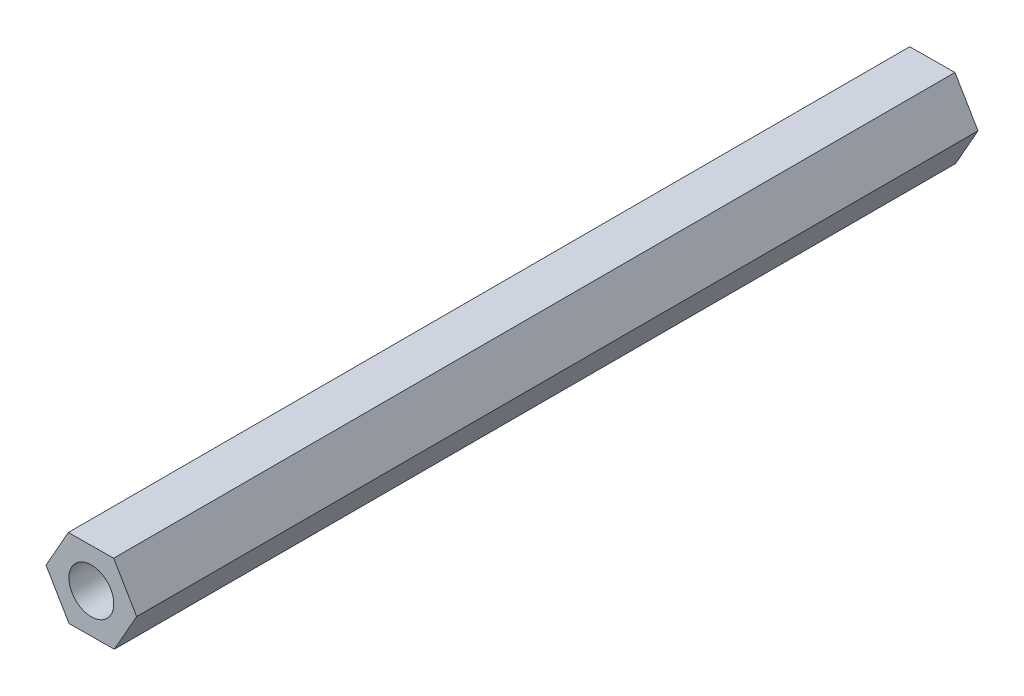
ISO-10303-21;
HEADER;
FILE_DESCRIPTION(('STEP AP214'),'2;1');
FILE_NAME('part.step','',(''),(''),'','','');
FILE_SCHEMA(('AUTOMOTIVE_DESIGN { 1 0 10303 214 1 1 1 1 }'));
ENDSEC;
DATA;
#1=APPLICATION_CONTEXT('core data for automotive mechanical design processes');
#2=APPLICATION_PROTOCOL_DEFINITION('international standard','automotive_design',2000,#1);
#3=PRODUCT_CONTEXT('',#1,'mechanical');
#4=PRODUCT('Part','Part','',(#3));
#5=PRODUCT_RELATED_PRODUCT_CATEGORY('part','',(#4));
#6=PRODUCT_DEFINITION_FORMATION('','',#4);
#7=PRODUCT_DEFINITION_CONTEXT('part definition',#1,'design');
#8=PRODUCT_DEFINITION('design','',#6,#7);
#9=PRODUCT_DEFINITION_SHAPE('','',#8);
#10=(LENGTH_UNIT() NAMED_UNIT(*) SI_UNIT(.MILLI.,.METRE.));
#11=(NAMED_UNIT(*) PLANE_ANGLE_UNIT() SI_UNIT($,.RADIAN.));
#12=(NAMED_UNIT(*) SI_UNIT($,.STERADIAN.) SOLID_ANGLE_UNIT());
#13=UNCERTAINTY_MEASURE_WITH_UNIT(LENGTH_MEASURE(1.E-05),#10,'distance_accuracy_value','');
#14=(GEOMETRIC_REPRESENTATION_CONTEXT(3) GLOBAL_UNCERTAINTY_ASSIGNED_CONTEXT((#13)) GLOBAL_UNIT_ASSIGNED_CONTEXT((#10,
#11,#12)) REPRESENTATION_CONTEXT('',''));
#15=CARTESIAN_POINT('',(0.,0.,0.));
#16=DIRECTION('',(0.,0.,1.));
#17=DIRECTION('',(1.,0.,0.));
#18=AXIS2_PLACEMENT_3D('',#15,#16,#17);
#19=CARTESIAN_POINT('',(0.,0.,75.));
#20=DIRECTION('',(0.,0.,1.));
#21=DIRECTION('',(1.,0.,0.));
#22=AXIS2_PLACEMENT_3D('',#19,#20,#21);
#23=PLANE('',#22);
#24=DIRECTION('',(0.999961257640527,0.00880245522430722,0.));
#25=VECTOR('',#24,1.);
#26=CARTESIAN_POINT('',(-1.98983906118775,-3.51765175136834,75.));
#27=LINE('',#26,#25);
#28=CARTESIAN_POINT('',(-1.98983906118775,-3.51765175136834,75.));
#29=VERTEX_POINT('',#28);
#30=CARTESIAN_POINT('',(2.05145624775792,-3.48207705211536,75.));
#31=VERTEX_POINT('',#30);
#32=EDGE_CURVE('E131',#29,#31,#27,.T.);
#33=ORIENTED_EDGE('',*,*,#32,.T.);
#34=DIRECTION('',(0.492357478980338,0.870393079529086,0.));
#35=VECTOR('',#34,1.);
#36=CARTESIAN_POINT('',(2.05145624775792,-3.48207705211536,75.));
#37=LINE('',#36,#35);
#38=CARTESIAN_POINT('',(4.04129530894568,0.0355746992529791,75.));
#39=VERTEX_POINT('',#38);
#40=EDGE_CURVE('E89',#31,#39,#37,.T.);
#41=ORIENTED_EDGE('',*,*,#40,.T.);
#42=DIRECTION('',(-0.507603778660189,0.861590624304779,0.));
#43=VECTOR('',#42,1.);
#44=CARTESIAN_POINT('',(4.04129530894568,0.0355746992529791,75.));
#45=LINE('',#44,#43);
#46=CARTESIAN_POINT('',(1.98983906118776,3.51765175136834,75.));
#47=VERTEX_POINT('',#46);
#48=EDGE_CURVE('E102',#39,#47,#45,.T.);
#49=ORIENTED_EDGE('',*,*,#48,.T.);
#50=DIRECTION('',(-0.999961257640527,-0.00880245522430723,0.));
#51=VECTOR('',#50,1.);
#52=CARTESIAN_POINT('',(1.98983906118776,3.51765175136834,75.));
#53=LINE('',#52,#51);
#54=CARTESIAN_POINT('',(-2.05145624775791,3.48207705211536,75.));
#55=VERTEX_POINT('',#54);
#56=EDGE_CURVE('E96',#47,#55,#53,.T.);
#57=ORIENTED_EDGE('',*,*,#56,.T.);
#58=DIRECTION('',(-0.492357478980338,-0.870393079529086,0.));
#59=VECTOR('',#58,1.);
#60=CARTESIAN_POINT('',(-2.05145624775791,3.48207705211536,75.));
#61=LINE('',#60,#59);
#62=CARTESIAN_POINT('',(-4.04129530894568,-0.0355746992529825,75.));
#63=VERTEX_POINT('',#62);
#64=EDGE_CURVE('E100',#55,#63,#61,.T.);
#65=ORIENTED_EDGE('',*,*,#64,.T.);
#66=DIRECTION('',(0.507603778660189,-0.861590624304779,0.));
#67=VECTOR('',#66,1.);
#68=CARTESIAN_POINT('',(-4.04129530894568,-0.0355746992529825,75.));
#69=LINE('',#68,#67);
#70=EDGE_CURVE('E52',#63,#29,#69,.T.);
#71=ORIENTED_EDGE('',*,*,#70,.T.);
#72=EDGE_LOOP('',(#33,#41,#49,#57,#65,#71));
#73=FACE_BOUND('',#72,.T.);
#74=CARTESIAN_POINT('',(0.,0.,75.));
#75=DIRECTION('',(0.,0.,1.));
#76=DIRECTION('',(1.,0.,0.));
#77=AXIS2_PLACEMENT_3D('',#74,#75,#76);
#78=CIRCLE('',#77,2.);
#79=CARTESIAN_POINT('',(2.,0.,75.));
#80=VERTEX_POINT('',#79);
#81=EDGE_CURVE('E124',#80,#80,#78,.T.);
#82=ORIENTED_EDGE('',*,*,#81,.F.);
#83=EDGE_LOOP('',(#82));
#84=FACE_BOUND('',#83,.T.);
#85=ADVANCED_FACE('F35',(#73,#84),#23,.T.);
#86=CARTESIAN_POINT('',(0.,0.,0.));
#87=DIRECTION('',(0.,0.,1.));
#88=DIRECTION('',(1.,0.,0.));
#89=AXIS2_PLACEMENT_3D('',#86,#87,#88);
#90=PLANE('',#89);
#91=DIRECTION('',(0.999961257640527,0.00880245522430722,0.));
#92=VECTOR('',#91,1.);
#93=CARTESIAN_POINT('',(-1.98983906118775,-3.51765175136834,0.));
#94=LINE('',#93,#92);
#95=CARTESIAN_POINT('',(-1.98983906118775,-3.51765175136834,0.));
#96=VERTEX_POINT('',#95);
#97=CARTESIAN_POINT('',(2.05145624775792,-3.48207705211536,0.));
#98=VERTEX_POINT('',#97);
#99=EDGE_CURVE('E120',#96,#98,#94,.T.);
#100=ORIENTED_EDGE('',*,*,#99,.F.);
#101=DIRECTION('',(0.507603778660189,-0.861590624304779,0.));
#102=VECTOR('',#101,1.);
#103=CARTESIAN_POINT('',(-4.04129530894568,-0.0355746992529825,0.));
#104=LINE('',#103,#102);
#105=CARTESIAN_POINT('',(-4.04129530894568,-0.0355746992529825,0.));
#106=VERTEX_POINT('',#105);
#107=EDGE_CURVE('E81',#106,#96,#104,.T.);
#108=ORIENTED_EDGE('',*,*,#107,.F.);
#109=DIRECTION('',(-0.492357478980338,-0.870393079529086,0.));
#110=VECTOR('',#109,1.);
#111=CARTESIAN_POINT('',(-2.05145624775791,3.48207705211536,0.));
#112=LINE('',#111,#110);
#113=CARTESIAN_POINT('',(-2.05145624775791,3.48207705211536,0.));
#114=VERTEX_POINT('',#113);
#115=EDGE_CURVE('E75',#114,#106,#112,.T.);
#116=ORIENTED_EDGE('',*,*,#115,.F.);
#117=DIRECTION('',(-0.999961257640527,-0.00880245522430723,0.));
#118=VECTOR('',#117,1.);
#119=CARTESIAN_POINT('',(1.98983906118776,3.51765175136834,0.));
#120=LINE('',#119,#118);
#121=CARTESIAN_POINT('',(1.98983906118776,3.51765175136834,0.));
#122=VERTEX_POINT('',#121);
#123=EDGE_CURVE('E110',#122,#114,#120,.T.);
#124=ORIENTED_EDGE('',*,*,#123,.F.);
#125=DIRECTION('',(-0.507603778660189,0.861590624304779,0.));
#126=VECTOR('',#125,1.);
#127=CARTESIAN_POINT('',(4.04129530894568,0.0355746992529791,0.));
#128=LINE('',#127,#126);
#129=CARTESIAN_POINT('',(4.04129530894568,0.0355746992529791,0.));
#130=VERTEX_POINT('',#129);
#131=EDGE_CURVE('E126',#130,#122,#128,.T.);
#132=ORIENTED_EDGE('',*,*,#131,.F.);
#133=DIRECTION('',(0.492357478980338,0.870393079529086,0.));
#134=VECTOR('',#133,1.);
#135=CARTESIAN_POINT('',(2.05145624775792,-3.48207705211536,0.));
#136=LINE('',#135,#134);
#137=EDGE_CURVE('E123',#98,#130,#136,.T.);
#138=ORIENTED_EDGE('',*,*,#137,.F.);
#139=EDGE_LOOP('',(#100,#108,#116,#124,#132,#138));
#140=FACE_BOUND('',#139,.T.);
#141=CARTESIAN_POINT('',(0.,0.,0.));
#142=DIRECTION('',(0.,0.,1.));
#143=DIRECTION('',(1.,0.,0.));
#144=AXIS2_PLACEMENT_3D('',#141,#142,#143);
#145=CIRCLE('',#144,2.);
#146=CARTESIAN_POINT('',(2.,0.,0.));
#147=VERTEX_POINT('',#146);
#148=EDGE_CURVE('E224',#147,#147,#145,.T.);
#149=ORIENTED_EDGE('',*,*,#148,.T.);
#150=EDGE_LOOP('',(#149));
#151=FACE_BOUND('',#150,.T.);
#152=ADVANCED_FACE('F140',(#140,#151),#90,.F.);
#153=CARTESIAN_POINT('',(-1.98983906118775,-3.51765175136834,75.));
#154=DIRECTION('',(-0.00880245522430722,0.999961257640527,0.));
#155=DIRECTION('',(-0.999961257640527,-0.00880245522430722,0.));
#156=AXIS2_PLACEMENT_3D('',#153,#154,#155);
#157=PLANE('',#156);
#158=ORIENTED_EDGE('',*,*,#99,.T.);
#159=DIRECTION('',(0.,0.,-1.));
#160=VECTOR('',#159,1.);
#161=CARTESIAN_POINT('',(2.05145624775792,-3.48207705211536,75.));
#162=LINE('',#161,#160);
#163=EDGE_CURVE('E11',#31,#98,#162,.T.);
#164=ORIENTED_EDGE('',*,*,#163,.F.);
#165=ORIENTED_EDGE('',*,*,#32,.F.);
#166=DIRECTION('',(0.,0.,-1.));
#167=VECTOR('',#166,1.);
#168=CARTESIAN_POINT('',(-1.98983906118775,-3.51765175136834,75.));
#169=LINE('',#168,#167);
#170=EDGE_CURVE('E116',#29,#96,#169,.T.);
#171=ORIENTED_EDGE('',*,*,#170,.T.);
#172=EDGE_LOOP('',(#158,#164,#165,#171));
#173=FACE_BOUND('',#172,.T.);
#174=ADVANCED_FACE('F37',(#173),#157,.F.);
#175=CARTESIAN_POINT('',(2.05145624775792,-3.48207705211536,75.));
#176=DIRECTION('',(-0.870393079529086,0.492357478980338,0.));
#177=DIRECTION('',(-0.492357478980338,-0.870393079529086,0.));
#178=AXIS2_PLACEMENT_3D('',#175,#176,#177);
#179=PLANE('',#178);
#180=ORIENTED_EDGE('',*,*,#137,.T.);
#181=DIRECTION('',(0.,0.,-1.));
#182=VECTOR('',#181,1.);
#183=CARTESIAN_POINT('',(4.04129530894568,0.0355746992529791,75.));
#184=LINE('',#183,#182);
#185=EDGE_CURVE('E44',#39,#130,#184,.T.);
#186=ORIENTED_EDGE('',*,*,#185,.F.);
#187=ORIENTED_EDGE('',*,*,#40,.F.);
#188=ORIENTED_EDGE('',*,*,#163,.T.);
#189=EDGE_LOOP('',(#180,#186,#187,#188));
#190=FACE_BOUND('',#189,.T.);
#191=ADVANCED_FACE('F165',(#190),#179,.F.);
#192=CARTESIAN_POINT('',(4.04129530894568,0.0355746992529791,75.));
#193=DIRECTION('',(-0.861590624304779,-0.507603778660189,0.));
#194=DIRECTION('',(0.507603778660189,-0.861590624304779,0.));
#195=AXIS2_PLACEMENT_3D('',#192,#193,#194);
#196=PLANE('',#195);
#197=ORIENTED_EDGE('',*,*,#131,.T.);
#198=DIRECTION('',(0.,0.,-1.));
#199=VECTOR('',#198,1.);
#200=CARTESIAN_POINT('',(1.98983906118776,3.51765175136834,75.));
#201=LINE('',#200,#199);
#202=EDGE_CURVE('E111',#47,#122,#201,.T.);
#203=ORIENTED_EDGE('',*,*,#202,.F.);
#204=ORIENTED_EDGE('',*,*,#48,.F.);
#205=ORIENTED_EDGE('',*,*,#185,.T.);
#206=EDGE_LOOP('',(#197,#203,#204,#205));
#207=FACE_BOUND('',#206,.T.);
#208=ADVANCED_FACE('F137',(#207),#196,.F.);
#209=CARTESIAN_POINT('',(1.98983906118776,3.51765175136834,75.));
#210=DIRECTION('',(0.00880245522430723,-0.999961257640527,0.));
#211=DIRECTION('',(0.999961257640527,0.00880245522430723,0.));
#212=AXIS2_PLACEMENT_3D('',#209,#210,#211);
#213=PLANE('',#212);
#214=ORIENTED_EDGE('',*,*,#123,.T.);
#215=DIRECTION('',(0.,0.,-1.));
#216=VECTOR('',#215,1.);
#217=CARTESIAN_POINT('',(-2.05145624775791,3.48207705211536,75.));
#218=LINE('',#217,#216);
#219=EDGE_CURVE('E107',#55,#114,#218,.T.);
#220=ORIENTED_EDGE('',*,*,#219,.F.);
#221=ORIENTED_EDGE('',*,*,#56,.F.);
#222=ORIENTED_EDGE('',*,*,#202,.T.);
#223=EDGE_LOOP('',(#214,#220,#221,#222));
#224=FACE_BOUND('',#223,.T.);
#225=ADVANCED_FACE('F108',(#224),#213,.F.);
#226=CARTESIAN_POINT('',(-2.05145624775791,3.48207705211536,75.));
#227=DIRECTION('',(0.870393079529086,-0.492357478980338,0.));
#228=DIRECTION('',(0.492357478980338,0.870393079529086,0.));
#229=AXIS2_PLACEMENT_3D('',#226,#227,#228);
#230=PLANE('',#229);
#231=ORIENTED_EDGE('',*,*,#115,.T.);
#232=DIRECTION('',(0.,0.,-1.));
#233=VECTOR('',#232,1.);
#234=CARTESIAN_POINT('',(-4.04129530894568,-0.0355746992529825,75.));
#235=LINE('',#234,#233);
#236=EDGE_CURVE('E112',#63,#106,#235,.T.);
#237=ORIENTED_EDGE('',*,*,#236,.F.);
#238=ORIENTED_EDGE('',*,*,#64,.F.);
#239=ORIENTED_EDGE('',*,*,#219,.T.);
#240=EDGE_LOOP('',(#231,#237,#238,#239));
#241=FACE_BOUND('',#240,.T.);
#242=ADVANCED_FACE('F114',(#241),#230,.F.);
#243=CARTESIAN_POINT('',(-4.04129530894568,-0.0355746992529825,75.));
#244=DIRECTION('',(0.861590624304779,0.507603778660189,0.));
#245=DIRECTION('',(-0.507603778660189,0.861590624304779,0.));
#246=AXIS2_PLACEMENT_3D('',#243,#244,#245);
#247=PLANE('',#246);
#248=ORIENTED_EDGE('',*,*,#107,.T.);
#249=ORIENTED_EDGE('',*,*,#170,.F.);
#250=ORIENTED_EDGE('',*,*,#70,.F.);
#251=ORIENTED_EDGE('',*,*,#236,.T.);
#252=EDGE_LOOP('',(#248,#249,#250,#251));
#253=FACE_BOUND('',#252,.T.);
#254=ADVANCED_FACE('F145',(#253),#247,.F.);
#255=CARTESIAN_POINT('',(0.,0.,75.));
#256=DIRECTION('',(0.,0.,-1.));
#257=DIRECTION('',(-1.,0.,0.));
#258=AXIS2_PLACEMENT_3D('',#255,#256,#257);
#259=CYLINDRICAL_SURFACE('',#258,2.);
#260=ORIENTED_EDGE('',*,*,#81,.T.);
#261=EDGE_LOOP('',(#260));
#262=FACE_BOUND('',#261,.T.);
#263=ORIENTED_EDGE('',*,*,#148,.F.);
#264=EDGE_LOOP('',(#263));
#265=FACE_BOUND('',#264,.T.);
#266=ADVANCED_FACE('F147',(#262,#265),#259,.F.);
#267=CLOSED_SHELL('',(#85,#152,#174,#191,#208,#225,#242,#254,#266));
#268=MANIFOLD_SOLID_BREP('B2',#267);
#269=ADVANCED_BREP_SHAPE_REPRESENTATION('',(#18,#268),#14);
#270=SHAPE_DEFINITION_REPRESENTATION(#9,#269);
ENDSEC;
END-ISO-10303-21;
